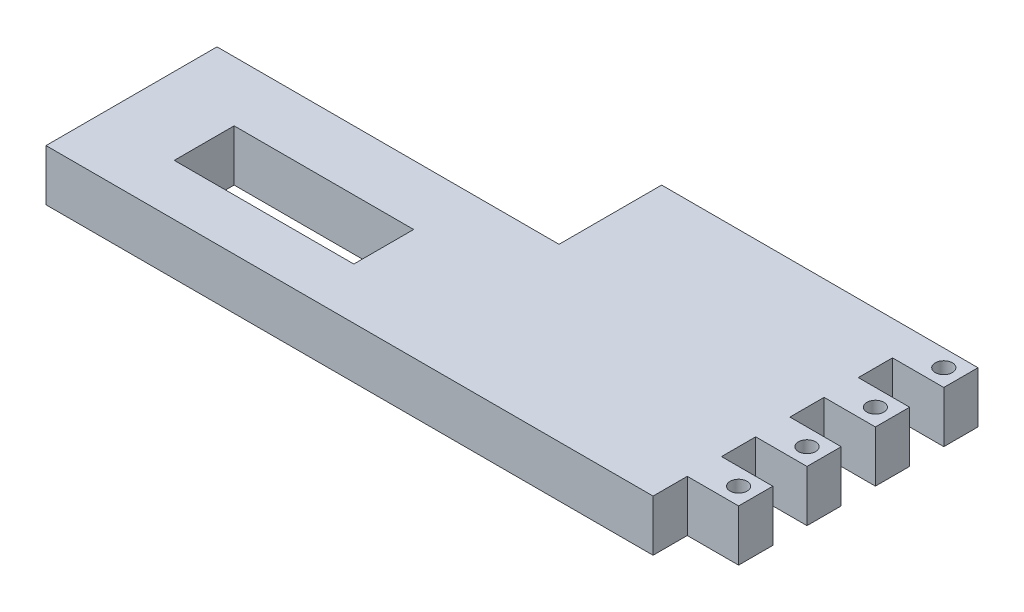
ISO-10303-21;
HEADER;
FILE_DESCRIPTION(('STEP AP214'),'2;1');
FILE_NAME('part.step','',(''),(''),'','','');
FILE_SCHEMA(('AUTOMOTIVE_DESIGN { 1 0 10303 214 1 1 1 1 }'));
ENDSEC;
DATA;
#1=APPLICATION_CONTEXT('core data for automotive mechanical design processes');
#2=APPLICATION_PROTOCOL_DEFINITION('international standard','automotive_design',2000,#1);
#3=PRODUCT_CONTEXT('',#1,'mechanical');
#4=PRODUCT('Part','Part','',(#3));
#5=PRODUCT_RELATED_PRODUCT_CATEGORY('part','',(#4));
#6=PRODUCT_DEFINITION_FORMATION('','',#4);
#7=PRODUCT_DEFINITION_CONTEXT('part definition',#1,'design');
#8=PRODUCT_DEFINITION('design','',#6,#7);
#9=PRODUCT_DEFINITION_SHAPE('','',#8);
#10=(LENGTH_UNIT() NAMED_UNIT(*) SI_UNIT(.MILLI.,.METRE.));
#11=(NAMED_UNIT(*) PLANE_ANGLE_UNIT() SI_UNIT($,.RADIAN.));
#12=(NAMED_UNIT(*) SI_UNIT($,.STERADIAN.) SOLID_ANGLE_UNIT());
#13=UNCERTAINTY_MEASURE_WITH_UNIT(LENGTH_MEASURE(1.E-05),#10,'distance_accuracy_value','');
#14=(GEOMETRIC_REPRESENTATION_CONTEXT(3) GLOBAL_UNCERTAINTY_ASSIGNED_CONTEXT((#13)) GLOBAL_UNIT_ASSIGNED_CONTEXT((#10,
#11,#12)) REPRESENTATION_CONTEXT('',''));
#15=CARTESIAN_POINT('',(0.,0.,0.));
#16=DIRECTION('',(0.,0.,1.));
#17=DIRECTION('',(1.,0.,0.));
#18=AXIS2_PLACEMENT_3D('',#15,#16,#17);
#19=CARTESIAN_POINT('',(-40.,6.,20.));
#20=DIRECTION('',(1.,0.,0.));
#21=DIRECTION('',(0.,0.,-1.));
#22=AXIS2_PLACEMENT_3D('',#19,#20,#21);
#23=PLANE('',#22);
#24=DIRECTION('',(0.,0.,1.));
#25=VECTOR('',#24,1.);
#26=CARTESIAN_POINT('',(-40.,0.,20.));
#27=LINE('',#26,#25);
#28=CARTESIAN_POINT('',(-40.,0.,0.));
#29=VERTEX_POINT('',#28);
#30=CARTESIAN_POINT('',(-40.,0.,20.));
#31=VERTEX_POINT('',#30);
#32=EDGE_CURVE('E232',#29,#31,#27,.T.);
#33=ORIENTED_EDGE('',*,*,#32,.T.);
#34=DIRECTION('',(0.,-1.,0.));
#35=VECTOR('',#34,1.);
#36=CARTESIAN_POINT('',(-40.,6.,20.));
#37=LINE('',#36,#35);
#38=CARTESIAN_POINT('',(-40.,6.,20.));
#39=VERTEX_POINT('',#38);
#40=EDGE_CURVE('E11',#39,#31,#37,.T.);
#41=ORIENTED_EDGE('',*,*,#40,.F.);
#42=DIRECTION('',(0.,0.,1.));
#43=VECTOR('',#42,1.);
#44=CARTESIAN_POINT('',(-40.,6.,20.));
#45=LINE('',#44,#43);
#46=CARTESIAN_POINT('',(-40.,6.,0.));
#47=VERTEX_POINT('',#46);
#48=EDGE_CURVE('E236',#47,#39,#45,.T.);
#49=ORIENTED_EDGE('',*,*,#48,.F.);
#50=DIRECTION('',(0.,-1.,0.));
#51=VECTOR('',#50,1.);
#52=CARTESIAN_POINT('',(-40.,6.,0.));
#53=LINE('',#52,#51);
#54=EDGE_CURVE('E278',#47,#29,#53,.T.);
#55=ORIENTED_EDGE('',*,*,#54,.T.);
#56=EDGE_LOOP('',(#33,#41,#49,#55));
#57=FACE_BOUND('',#56,.T.);
#58=ADVANCED_FACE('F35',(#57),#23,.F.);
#59=CARTESIAN_POINT('',(31.,6.,20.));
#60=DIRECTION('',(0.,0.,-1.));
#61=DIRECTION('',(-1.,0.,0.));
#62=AXIS2_PLACEMENT_3D('',#59,#60,#61);
#63=PLANE('',#62);
#64=DIRECTION('',(1.,0.,0.));
#65=VECTOR('',#64,1.);
#66=CARTESIAN_POINT('',(31.,0.,20.));
#67=LINE('',#66,#65);
#68=CARTESIAN_POINT('',(31.,0.,20.));
#69=VERTEX_POINT('',#68);
#70=EDGE_CURVE('E281',#31,#69,#67,.T.);
#71=ORIENTED_EDGE('',*,*,#70,.T.);
#72=DIRECTION('',(0.,-1.,0.));
#73=VECTOR('',#72,1.);
#74=CARTESIAN_POINT('',(31.,6.,20.));
#75=LINE('',#74,#73);
#76=CARTESIAN_POINT('',(31.,6.,20.));
#77=VERTEX_POINT('',#76);
#78=EDGE_CURVE('E42',#77,#69,#75,.T.);
#79=ORIENTED_EDGE('',*,*,#78,.F.);
#80=DIRECTION('',(1.,0.,0.));
#81=VECTOR('',#80,1.);
#82=CARTESIAN_POINT('',(31.,6.,20.));
#83=LINE('',#82,#81);
#84=EDGE_CURVE('E239',#39,#77,#83,.T.);
#85=ORIENTED_EDGE('',*,*,#84,.F.);
#86=ORIENTED_EDGE('',*,*,#40,.T.);
#87=EDGE_LOOP('',(#71,#79,#85,#86));
#88=FACE_BOUND('',#87,.T.);
#89=ADVANCED_FACE('F396',(#88),#63,.F.);
#90=CARTESIAN_POINT('',(31.,6.,16.));
#91=DIRECTION('',(-1.,0.,0.));
#92=DIRECTION('',(0.,0.,1.));
#93=AXIS2_PLACEMENT_3D('',#90,#91,#92);
#94=PLANE('',#93);
#95=DIRECTION('',(0.,0.,-1.));
#96=VECTOR('',#95,1.);
#97=CARTESIAN_POINT('',(31.,0.,16.));
#98=LINE('',#97,#96);
#99=CARTESIAN_POINT('',(31.,0.,16.));
#100=VERTEX_POINT('',#99);
#101=EDGE_CURVE('E283',#69,#100,#98,.T.);
#102=ORIENTED_EDGE('',*,*,#101,.T.);
#103=DIRECTION('',(0.,-1.,0.));
#104=VECTOR('',#103,1.);
#105=CARTESIAN_POINT('',(31.,6.,16.));
#106=LINE('',#105,#104);
#107=CARTESIAN_POINT('',(31.,6.,16.));
#108=VERTEX_POINT('',#107);
#109=EDGE_CURVE('E368',#108,#100,#106,.T.);
#110=ORIENTED_EDGE('',*,*,#109,.F.);
#111=DIRECTION('',(0.,0.,-1.));
#112=VECTOR('',#111,1.);
#113=CARTESIAN_POINT('',(31.,6.,16.));
#114=LINE('',#113,#112);
#115=EDGE_CURVE('E242',#77,#108,#114,.T.);
#116=ORIENTED_EDGE('',*,*,#115,.F.);
#117=ORIENTED_EDGE('',*,*,#78,.T.);
#118=EDGE_LOOP('',(#102,#110,#116,#117));
#119=FACE_BOUND('',#118,.T.);
#120=ADVANCED_FACE('F375',(#119),#94,.F.);
#121=CARTESIAN_POINT('',(37.,6.,16.));
#122=DIRECTION('',(0.,0.,-1.));
#123=DIRECTION('',(-1.,0.,0.));
#124=AXIS2_PLACEMENT_3D('',#121,#122,#123);
#125=PLANE('',#124);
#126=DIRECTION('',(1.,0.,0.));
#127=VECTOR('',#126,1.);
#128=CARTESIAN_POINT('',(37.,0.,16.));
#129=LINE('',#128,#127);
#130=CARTESIAN_POINT('',(37.,0.,16.));
#131=VERTEX_POINT('',#130);
#132=EDGE_CURVE('E285',#100,#131,#129,.T.);
#133=ORIENTED_EDGE('',*,*,#132,.T.);
#134=DIRECTION('',(0.,-1.,0.));
#135=VECTOR('',#134,1.);
#136=CARTESIAN_POINT('',(37.,6.,16.));
#137=LINE('',#136,#135);
#138=CARTESIAN_POINT('',(37.,6.,16.));
#139=VERTEX_POINT('',#138);
#140=EDGE_CURVE('E365',#139,#131,#137,.T.);
#141=ORIENTED_EDGE('',*,*,#140,.F.);
#142=DIRECTION('',(1.,0.,0.));
#143=VECTOR('',#142,1.);
#144=CARTESIAN_POINT('',(37.,6.,16.));
#145=LINE('',#144,#143);
#146=EDGE_CURVE('E244',#108,#139,#145,.T.);
#147=ORIENTED_EDGE('',*,*,#146,.F.);
#148=ORIENTED_EDGE('',*,*,#109,.T.);
#149=EDGE_LOOP('',(#133,#141,#147,#148));
#150=FACE_BOUND('',#149,.T.);
#151=ADVANCED_FACE('F384',(#150),#125,.F.);
#152=CARTESIAN_POINT('',(37.,6.,12.));
#153=DIRECTION('',(-1.,0.,0.));
#154=DIRECTION('',(0.,0.,1.));
#155=AXIS2_PLACEMENT_3D('',#152,#153,#154);
#156=PLANE('',#155);
#157=DIRECTION('',(0.,0.,-1.));
#158=VECTOR('',#157,1.);
#159=CARTESIAN_POINT('',(37.,0.,12.));
#160=LINE('',#159,#158);
#161=CARTESIAN_POINT('',(37.,0.,12.));
#162=VERTEX_POINT('',#161);
#163=EDGE_CURVE('E287',#131,#162,#160,.T.);
#164=ORIENTED_EDGE('',*,*,#163,.T.);
#165=DIRECTION('',(0.,-1.,0.));
#166=VECTOR('',#165,1.);
#167=CARTESIAN_POINT('',(37.,6.,12.));
#168=LINE('',#167,#166);
#169=CARTESIAN_POINT('',(37.,6.,12.));
#170=VERTEX_POINT('',#169);
#171=EDGE_CURVE('E362',#170,#162,#168,.T.);
#172=ORIENTED_EDGE('',*,*,#171,.F.);
#173=DIRECTION('',(0.,0.,-1.));
#174=VECTOR('',#173,1.);
#175=CARTESIAN_POINT('',(37.,6.,12.));
#176=LINE('',#175,#174);
#177=EDGE_CURVE('E246',#139,#170,#176,.T.);
#178=ORIENTED_EDGE('',*,*,#177,.F.);
#179=ORIENTED_EDGE('',*,*,#140,.T.);
#180=EDGE_LOOP('',(#164,#172,#178,#179));
#181=FACE_BOUND('',#180,.T.);
#182=ADVANCED_FACE('F388',(#181),#156,.F.);
#183=CARTESIAN_POINT('',(31.,6.,12.));
#184=DIRECTION('',(0.,0.,1.));
#185=DIRECTION('',(1.,0.,0.));
#186=AXIS2_PLACEMENT_3D('',#183,#184,#185);
#187=PLANE('',#186);
#188=DIRECTION('',(-1.,0.,0.));
#189=VECTOR('',#188,1.);
#190=CARTESIAN_POINT('',(31.,0.,12.));
#191=LINE('',#190,#189);
#192=CARTESIAN_POINT('',(31.,0.,12.));
#193=VERTEX_POINT('',#192);
#194=EDGE_CURVE('E289',#162,#193,#191,.T.);
#195=ORIENTED_EDGE('',*,*,#194,.T.);
#196=DIRECTION('',(0.,-1.,0.));
#197=VECTOR('',#196,1.);
#198=CARTESIAN_POINT('',(31.,6.,12.));
#199=LINE('',#198,#197);
#200=CARTESIAN_POINT('',(31.,6.,12.));
#201=VERTEX_POINT('',#200);
#202=EDGE_CURVE('E359',#201,#193,#199,.T.);
#203=ORIENTED_EDGE('',*,*,#202,.F.);
#204=DIRECTION('',(-1.,0.,0.));
#205=VECTOR('',#204,1.);
#206=CARTESIAN_POINT('',(31.,6.,12.));
#207=LINE('',#206,#205);
#208=EDGE_CURVE('E248',#170,#201,#207,.T.);
#209=ORIENTED_EDGE('',*,*,#208,.F.);
#210=ORIENTED_EDGE('',*,*,#171,.T.);
#211=EDGE_LOOP('',(#195,#203,#209,#210));
#212=FACE_BOUND('',#211,.T.);
#213=ADVANCED_FACE('F469',(#212),#187,.F.);
#214=CARTESIAN_POINT('',(31.,6.,12.));
#215=DIRECTION('',(-1.,0.,0.));
#216=DIRECTION('',(0.,0.,1.));
#217=AXIS2_PLACEMENT_3D('',#214,#215,#216);
#218=PLANE('',#217);
#219=DIRECTION('',(0.,0.,-1.));
#220=VECTOR('',#219,1.);
#221=CARTESIAN_POINT('',(31.,0.,12.));
#222=LINE('',#221,#220);
#223=CARTESIAN_POINT('',(31.,0.,8.));
#224=VERTEX_POINT('',#223);
#225=EDGE_CURVE('E291',#193,#224,#222,.T.);
#226=ORIENTED_EDGE('',*,*,#225,.T.);
#227=DIRECTION('',(0.,-1.,0.));
#228=VECTOR('',#227,1.);
#229=CARTESIAN_POINT('',(31.,6.,8.));
#230=LINE('',#229,#228);
#231=CARTESIAN_POINT('',(31.,6.,8.));
#232=VERTEX_POINT('',#231);
#233=EDGE_CURVE('E356',#232,#224,#230,.T.);
#234=ORIENTED_EDGE('',*,*,#233,.F.);
#235=DIRECTION('',(0.,0.,-1.));
#236=VECTOR('',#235,1.);
#237=CARTESIAN_POINT('',(31.,6.,12.));
#238=LINE('',#237,#236);
#239=EDGE_CURVE('E250',#201,#232,#238,.T.);
#240=ORIENTED_EDGE('',*,*,#239,.F.);
#241=ORIENTED_EDGE('',*,*,#202,.T.);
#242=EDGE_LOOP('',(#226,#234,#240,#241));
#243=FACE_BOUND('',#242,.T.);
#244=ADVANCED_FACE('F467',(#243),#218,.F.);
#245=CARTESIAN_POINT('',(37.,6.,8.));
#246=DIRECTION('',(0.,0.,-1.));
#247=DIRECTION('',(-1.,0.,0.));
#248=AXIS2_PLACEMENT_3D('',#245,#246,#247);
#249=PLANE('',#248);
#250=DIRECTION('',(1.,0.,0.));
#251=VECTOR('',#250,1.);
#252=CARTESIAN_POINT('',(37.,0.,8.));
#253=LINE('',#252,#251);
#254=CARTESIAN_POINT('',(37.,0.,8.));
#255=VERTEX_POINT('',#254);
#256=EDGE_CURVE('E293',#224,#255,#253,.T.);
#257=ORIENTED_EDGE('',*,*,#256,.T.);
#258=DIRECTION('',(0.,-1.,0.));
#259=VECTOR('',#258,1.);
#260=CARTESIAN_POINT('',(37.,6.,8.));
#261=LINE('',#260,#259);
#262=CARTESIAN_POINT('',(37.,6.,8.));
#263=VERTEX_POINT('',#262);
#264=EDGE_CURVE('E353',#263,#255,#261,.T.);
#265=ORIENTED_EDGE('',*,*,#264,.F.);
#266=DIRECTION('',(1.,0.,0.));
#267=VECTOR('',#266,1.);
#268=CARTESIAN_POINT('',(37.,6.,8.));
#269=LINE('',#268,#267);
#270=EDGE_CURVE('E252',#232,#263,#269,.T.);
#271=ORIENTED_EDGE('',*,*,#270,.F.);
#272=ORIENTED_EDGE('',*,*,#233,.T.);
#273=EDGE_LOOP('',(#257,#265,#271,#272));
#274=FACE_BOUND('',#273,.T.);
#275=ADVANCED_FACE('F462',(#274),#249,.F.);
#276=CARTESIAN_POINT('',(37.,6.,4.));
#277=DIRECTION('',(-1.,0.,0.));
#278=DIRECTION('',(0.,0.,1.));
#279=AXIS2_PLACEMENT_3D('',#276,#277,#278);
#280=PLANE('',#279);
#281=DIRECTION('',(0.,0.,-1.));
#282=VECTOR('',#281,1.);
#283=CARTESIAN_POINT('',(37.,0.,4.));
#284=LINE('',#283,#282);
#285=CARTESIAN_POINT('',(37.,0.,4.));
#286=VERTEX_POINT('',#285);
#287=EDGE_CURVE('E295',#255,#286,#284,.T.);
#288=ORIENTED_EDGE('',*,*,#287,.T.);
#289=DIRECTION('',(0.,-1.,0.));
#290=VECTOR('',#289,1.);
#291=CARTESIAN_POINT('',(37.,6.,4.));
#292=LINE('',#291,#290);
#293=CARTESIAN_POINT('',(37.,6.,4.));
#294=VERTEX_POINT('',#293);
#295=EDGE_CURVE('E350',#294,#286,#292,.T.);
#296=ORIENTED_EDGE('',*,*,#295,.F.);
#297=DIRECTION('',(0.,0.,-1.));
#298=VECTOR('',#297,1.);
#299=CARTESIAN_POINT('',(37.,6.,4.));
#300=LINE('',#299,#298);
#301=EDGE_CURVE('E254',#263,#294,#300,.T.);
#302=ORIENTED_EDGE('',*,*,#301,.F.);
#303=ORIENTED_EDGE('',*,*,#264,.T.);
#304=EDGE_LOOP('',(#288,#296,#302,#303));
#305=FACE_BOUND('',#304,.T.);
#306=ADVANCED_FACE('F457',(#305),#280,.F.);
#307=CARTESIAN_POINT('',(31.,6.,4.));
#308=DIRECTION('',(0.,0.,1.));
#309=DIRECTION('',(1.,0.,0.));
#310=AXIS2_PLACEMENT_3D('',#307,#308,#309);
#311=PLANE('',#310);
#312=DIRECTION('',(-1.,0.,0.));
#313=VECTOR('',#312,1.);
#314=CARTESIAN_POINT('',(31.,0.,4.));
#315=LINE('',#314,#313);
#316=CARTESIAN_POINT('',(31.,0.,4.));
#317=VERTEX_POINT('',#316);
#318=EDGE_CURVE('E297',#286,#317,#315,.T.);
#319=ORIENTED_EDGE('',*,*,#318,.T.);
#320=DIRECTION('',(0.,-1.,0.));
#321=VECTOR('',#320,1.);
#322=CARTESIAN_POINT('',(31.,6.,4.));
#323=LINE('',#322,#321);
#324=CARTESIAN_POINT('',(31.,6.,4.));
#325=VERTEX_POINT('',#324);
#326=EDGE_CURVE('E347',#325,#317,#323,.T.);
#327=ORIENTED_EDGE('',*,*,#326,.F.);
#328=DIRECTION('',(-1.,0.,0.));
#329=VECTOR('',#328,1.);
#330=CARTESIAN_POINT('',(31.,6.,4.));
#331=LINE('',#330,#329);
#332=EDGE_CURVE('E256',#294,#325,#331,.T.);
#333=ORIENTED_EDGE('',*,*,#332,.F.);
#334=ORIENTED_EDGE('',*,*,#295,.T.);
#335=EDGE_LOOP('',(#319,#327,#333,#334));
#336=FACE_BOUND('',#335,.T.);
#337=ADVANCED_FACE('F453',(#336),#311,.F.);
#338=CARTESIAN_POINT('',(31.,6.,0.));
#339=DIRECTION('',(-1.,0.,0.));
#340=DIRECTION('',(0.,0.,1.));
#341=AXIS2_PLACEMENT_3D('',#338,#339,#340);
#342=PLANE('',#341);
#343=DIRECTION('',(0.,0.,-1.));
#344=VECTOR('',#343,1.);
#345=CARTESIAN_POINT('',(31.,0.,0.));
#346=LINE('',#345,#344);
#347=CARTESIAN_POINT('',(31.,0.,0.));
#348=VERTEX_POINT('',#347);
#349=EDGE_CURVE('E299',#317,#348,#346,.T.);
#350=ORIENTED_EDGE('',*,*,#349,.T.);
#351=DIRECTION('',(0.,-1.,0.));
#352=VECTOR('',#351,1.);
#353=CARTESIAN_POINT('',(31.,6.,0.));
#354=LINE('',#353,#352);
#355=CARTESIAN_POINT('',(31.,6.,0.));
#356=VERTEX_POINT('',#355);
#357=EDGE_CURVE('E344',#356,#348,#354,.T.);
#358=ORIENTED_EDGE('',*,*,#357,.F.);
#359=DIRECTION('',(0.,0.,-1.));
#360=VECTOR('',#359,1.);
#361=CARTESIAN_POINT('',(31.,6.,0.));
#362=LINE('',#361,#360);
#363=EDGE_CURVE('E258',#325,#356,#362,.T.);
#364=ORIENTED_EDGE('',*,*,#363,.F.);
#365=ORIENTED_EDGE('',*,*,#326,.T.);
#366=EDGE_LOOP('',(#350,#358,#364,#365));
#367=FACE_BOUND('',#366,.T.);
#368=ADVANCED_FACE('F448',(#367),#342,.F.);
#369=CARTESIAN_POINT('',(37.,6.,0.));
#370=DIRECTION('',(0.,0.,-1.));
#371=DIRECTION('',(-1.,0.,0.));
#372=AXIS2_PLACEMENT_3D('',#369,#370,#371);
#373=PLANE('',#372);
#374=DIRECTION('',(1.,0.,0.));
#375=VECTOR('',#374,1.);
#376=CARTESIAN_POINT('',(37.,0.,0.));
#377=LINE('',#376,#375);
#378=CARTESIAN_POINT('',(37.,0.,0.));
#379=VERTEX_POINT('',#378);
#380=EDGE_CURVE('E301',#348,#379,#377,.T.);
#381=ORIENTED_EDGE('',*,*,#380,.T.);
#382=DIRECTION('',(0.,-1.,0.));
#383=VECTOR('',#382,1.);
#384=CARTESIAN_POINT('',(37.,6.,0.));
#385=LINE('',#384,#383);
#386=CARTESIAN_POINT('',(37.,6.,0.));
#387=VERTEX_POINT('',#386);
#388=EDGE_CURVE('E341',#387,#379,#385,.T.);
#389=ORIENTED_EDGE('',*,*,#388,.F.);
#390=DIRECTION('',(1.,0.,0.));
#391=VECTOR('',#390,1.);
#392=CARTESIAN_POINT('',(37.,6.,0.));
#393=LINE('',#392,#391);
#394=EDGE_CURVE('E260',#356,#387,#393,.T.);
#395=ORIENTED_EDGE('',*,*,#394,.F.);
#396=ORIENTED_EDGE('',*,*,#357,.T.);
#397=EDGE_LOOP('',(#381,#389,#395,#396));
#398=FACE_BOUND('',#397,.T.);
#399=ADVANCED_FACE('F442',(#398),#373,.F.);
#400=CARTESIAN_POINT('',(37.,6.,0.));
#401=DIRECTION('',(-1.,0.,0.));
#402=DIRECTION('',(0.,0.,1.));
#403=AXIS2_PLACEMENT_3D('',#400,#401,#402);
#404=PLANE('',#403);
#405=DIRECTION('',(0.,0.,-1.));
#406=VECTOR('',#405,1.);
#407=CARTESIAN_POINT('',(37.,0.,0.));
#408=LINE('',#407,#406);
#409=CARTESIAN_POINT('',(37.,0.,-4.));
#410=VERTEX_POINT('',#409);
#411=EDGE_CURVE('E303',#379,#410,#408,.T.);
#412=ORIENTED_EDGE('',*,*,#411,.T.);
#413=DIRECTION('',(0.,-1.,0.));
#414=VECTOR('',#413,1.);
#415=CARTESIAN_POINT('',(37.,6.,-4.));
#416=LINE('',#415,#414);
#417=CARTESIAN_POINT('',(37.,6.,-4.));
#418=VERTEX_POINT('',#417);
#419=EDGE_CURVE('E338',#418,#410,#416,.T.);
#420=ORIENTED_EDGE('',*,*,#419,.F.);
#421=DIRECTION('',(0.,0.,-1.));
#422=VECTOR('',#421,1.);
#423=CARTESIAN_POINT('',(37.,6.,0.));
#424=LINE('',#423,#422);
#425=EDGE_CURVE('E262',#387,#418,#424,.T.);
#426=ORIENTED_EDGE('',*,*,#425,.F.);
#427=ORIENTED_EDGE('',*,*,#388,.T.);
#428=EDGE_LOOP('',(#412,#420,#426,#427));
#429=FACE_BOUND('',#428,.T.);
#430=ADVANCED_FACE('F438',(#429),#404,.F.);
#431=CARTESIAN_POINT('',(37.,6.,-4.));
#432=DIRECTION('',(0.,0.,1.));
#433=DIRECTION('',(1.,0.,0.));
#434=AXIS2_PLACEMENT_3D('',#431,#432,#433);
#435=PLANE('',#434);
#436=DIRECTION('',(-1.,0.,0.));
#437=VECTOR('',#436,1.);
#438=CARTESIAN_POINT('',(37.,0.,-4.));
#439=LINE('',#438,#437);
#440=CARTESIAN_POINT('',(31.,0.,-4.));
#441=VERTEX_POINT('',#440);
#442=EDGE_CURVE('E305',#410,#441,#439,.T.);
#443=ORIENTED_EDGE('',*,*,#442,.T.);
#444=DIRECTION('',(0.,-1.,0.));
#445=VECTOR('',#444,1.);
#446=CARTESIAN_POINT('',(31.,6.,-4.));
#447=LINE('',#446,#445);
#448=CARTESIAN_POINT('',(31.,6.,-4.));
#449=VERTEX_POINT('',#448);
#450=EDGE_CURVE('E335',#449,#441,#447,.T.);
#451=ORIENTED_EDGE('',*,*,#450,.F.);
#452=DIRECTION('',(-1.,0.,0.));
#453=VECTOR('',#452,1.);
#454=CARTESIAN_POINT('',(37.,6.,-4.));
#455=LINE('',#454,#453);
#456=EDGE_CURVE('E264',#418,#449,#455,.T.);
#457=ORIENTED_EDGE('',*,*,#456,.F.);
#458=ORIENTED_EDGE('',*,*,#419,.T.);
#459=EDGE_LOOP('',(#443,#451,#457,#458));
#460=FACE_BOUND('',#459,.T.);
#461=ADVANCED_FACE('F433',(#460),#435,.F.);
#462=CARTESIAN_POINT('',(31.,6.,-4.));
#463=DIRECTION('',(-1.,0.,0.));
#464=DIRECTION('',(0.,0.,1.));
#465=AXIS2_PLACEMENT_3D('',#462,#463,#464);
#466=PLANE('',#465);
#467=DIRECTION('',(0.,0.,-1.));
#468=VECTOR('',#467,1.);
#469=CARTESIAN_POINT('',(31.,0.,-4.));
#470=LINE('',#469,#468);
#471=CARTESIAN_POINT('',(31.,0.,-8.));
#472=VERTEX_POINT('',#471);
#473=EDGE_CURVE('E307',#441,#472,#470,.T.);
#474=ORIENTED_EDGE('',*,*,#473,.T.);
#475=DIRECTION('',(0.,-1.,0.));
#476=VECTOR('',#475,1.);
#477=CARTESIAN_POINT('',(31.,6.,-8.));
#478=LINE('',#477,#476);
#479=CARTESIAN_POINT('',(31.,6.,-8.));
#480=VERTEX_POINT('',#479);
#481=EDGE_CURVE('E332',#480,#472,#478,.T.);
#482=ORIENTED_EDGE('',*,*,#481,.F.);
#483=DIRECTION('',(0.,0.,-1.));
#484=VECTOR('',#483,1.);
#485=CARTESIAN_POINT('',(31.,6.,-4.));
#486=LINE('',#485,#484);
#487=EDGE_CURVE('E266',#449,#480,#486,.T.);
#488=ORIENTED_EDGE('',*,*,#487,.F.);
#489=ORIENTED_EDGE('',*,*,#450,.T.);
#490=EDGE_LOOP('',(#474,#482,#488,#489));
#491=FACE_BOUND('',#490,.T.);
#492=ADVANCED_FACE('F427',(#491),#466,.F.);
#493=CARTESIAN_POINT('',(31.,6.,-8.));
#494=DIRECTION('',(0.,0.,-1.));
#495=DIRECTION('',(-1.,0.,0.));
#496=AXIS2_PLACEMENT_3D('',#493,#494,#495);
#497=PLANE('',#496);
#498=DIRECTION('',(1.,0.,0.));
#499=VECTOR('',#498,1.);
#500=CARTESIAN_POINT('',(31.,0.,-8.));
#501=LINE('',#500,#499);
#502=CARTESIAN_POINT('',(37.,0.,-8.));
#503=VERTEX_POINT('',#502);
#504=EDGE_CURVE('E309',#472,#503,#501,.T.);
#505=ORIENTED_EDGE('',*,*,#504,.T.);
#506=DIRECTION('',(0.,-1.,0.));
#507=VECTOR('',#506,1.);
#508=CARTESIAN_POINT('',(37.,6.,-8.));
#509=LINE('',#508,#507);
#510=CARTESIAN_POINT('',(37.,6.,-8.));
#511=VERTEX_POINT('',#510);
#512=EDGE_CURVE('E329',#511,#503,#509,.T.);
#513=ORIENTED_EDGE('',*,*,#512,.F.);
#514=DIRECTION('',(1.,0.,0.));
#515=VECTOR('',#514,1.);
#516=CARTESIAN_POINT('',(31.,6.,-8.));
#517=LINE('',#516,#515);
#518=EDGE_CURVE('E268',#480,#511,#517,.T.);
#519=ORIENTED_EDGE('',*,*,#518,.F.);
#520=ORIENTED_EDGE('',*,*,#481,.T.);
#521=EDGE_LOOP('',(#505,#513,#519,#520));
#522=FACE_BOUND('',#521,.T.);
#523=ADVANCED_FACE('F423',(#522),#497,.F.);
#524=CARTESIAN_POINT('',(37.,6.,-8.));
#525=DIRECTION('',(-1.,0.,0.));
#526=DIRECTION('',(0.,0.,1.));
#527=AXIS2_PLACEMENT_3D('',#524,#525,#526);
#528=PLANE('',#527);
#529=DIRECTION('',(0.,0.,-1.));
#530=VECTOR('',#529,1.);
#531=CARTESIAN_POINT('',(37.,0.,-8.));
#532=LINE('',#531,#530);
#533=CARTESIAN_POINT('',(37.,0.,-12.));
#534=VERTEX_POINT('',#533);
#535=EDGE_CURVE('E311',#503,#534,#532,.T.);
#536=ORIENTED_EDGE('',*,*,#535,.T.);
#537=DIRECTION('',(0.,-1.,0.));
#538=VECTOR('',#537,1.);
#539=CARTESIAN_POINT('',(37.,6.,-12.));
#540=LINE('',#539,#538);
#541=CARTESIAN_POINT('',(37.,6.,-12.));
#542=VERTEX_POINT('',#541);
#543=EDGE_CURVE('E326',#542,#534,#540,.T.);
#544=ORIENTED_EDGE('',*,*,#543,.F.);
#545=DIRECTION('',(0.,0.,-1.));
#546=VECTOR('',#545,1.);
#547=CARTESIAN_POINT('',(37.,6.,-8.));
#548=LINE('',#547,#546);
#549=EDGE_CURVE('E270',#511,#542,#548,.T.);
#550=ORIENTED_EDGE('',*,*,#549,.F.);
#551=ORIENTED_EDGE('',*,*,#512,.T.);
#552=EDGE_LOOP('',(#536,#544,#550,#551));
#553=FACE_BOUND('',#552,.T.);
#554=ADVANCED_FACE('F418',(#553),#528,.F.);
#555=CARTESIAN_POINT('',(0.,6.,-12.));
#556=DIRECTION('',(0.,0.,1.));
#557=DIRECTION('',(1.,0.,0.));
#558=AXIS2_PLACEMENT_3D('',#555,#556,#557);
#559=PLANE('',#558);
#560=DIRECTION('',(-1.,0.,0.));
#561=VECTOR('',#560,1.);
#562=CARTESIAN_POINT('',(0.,0.,-12.));
#563=LINE('',#562,#561);
#564=CARTESIAN_POINT('',(0.,0.,-12.));
#565=VERTEX_POINT('',#564);
#566=EDGE_CURVE('E313',#534,#565,#563,.T.);
#567=ORIENTED_EDGE('',*,*,#566,.T.);
#568=DIRECTION('',(0.,-1.,0.));
#569=VECTOR('',#568,1.);
#570=CARTESIAN_POINT('',(0.,6.,-12.));
#571=LINE('',#570,#569);
#572=CARTESIAN_POINT('',(0.,6.,-12.));
#573=VERTEX_POINT('',#572);
#574=EDGE_CURVE('E323',#573,#565,#571,.T.);
#575=ORIENTED_EDGE('',*,*,#574,.F.);
#576=DIRECTION('',(-1.,0.,0.));
#577=VECTOR('',#576,1.);
#578=CARTESIAN_POINT('',(0.,6.,-12.));
#579=LINE('',#578,#577);
#580=EDGE_CURVE('E272',#542,#573,#579,.T.);
#581=ORIENTED_EDGE('',*,*,#580,.F.);
#582=ORIENTED_EDGE('',*,*,#543,.T.);
#583=EDGE_LOOP('',(#567,#575,#581,#582));
#584=FACE_BOUND('',#583,.T.);
#585=ADVANCED_FACE('F412',(#584),#559,.F.);
#586=CARTESIAN_POINT('',(0.,6.,0.));
#587=DIRECTION('',(1.,0.,0.));
#588=DIRECTION('',(0.,0.,-1.));
#589=AXIS2_PLACEMENT_3D('',#586,#587,#588);
#590=PLANE('',#589);
#591=DIRECTION('',(0.,0.,1.));
#592=VECTOR('',#591,1.);
#593=CARTESIAN_POINT('',(0.,0.,0.));
#594=LINE('',#593,#592);
#595=CARTESIAN_POINT('',(0.,0.,0.));
#596=VERTEX_POINT('',#595);
#597=EDGE_CURVE('E315',#565,#596,#594,.T.);
#598=ORIENTED_EDGE('',*,*,#597,.T.);
#599=DIRECTION('',(0.,-1.,0.));
#600=VECTOR('',#599,1.);
#601=CARTESIAN_POINT('',(0.,6.,0.));
#602=LINE('',#601,#600);
#603=CARTESIAN_POINT('',(0.,6.,0.));
#604=VERTEX_POINT('',#603);
#605=EDGE_CURVE('E320',#604,#596,#602,.T.);
#606=ORIENTED_EDGE('',*,*,#605,.F.);
#607=DIRECTION('',(0.,0.,1.));
#608=VECTOR('',#607,1.);
#609=CARTESIAN_POINT('',(0.,6.,0.));
#610=LINE('',#609,#608);
#611=EDGE_CURVE('E274',#573,#604,#610,.T.);
#612=ORIENTED_EDGE('',*,*,#611,.F.);
#613=ORIENTED_EDGE('',*,*,#574,.T.);
#614=EDGE_LOOP('',(#598,#606,#612,#613));
#615=FACE_BOUND('',#614,.T.);
#616=ADVANCED_FACE('F408',(#615),#590,.F.);
#617=CARTESIAN_POINT('',(-40.,6.,0.));
#618=DIRECTION('',(0.,0.,1.));
#619=DIRECTION('',(1.,0.,0.));
#620=AXIS2_PLACEMENT_3D('',#617,#618,#619);
#621=PLANE('',#620);
#622=DIRECTION('',(-1.,0.,0.));
#623=VECTOR('',#622,1.);
#624=CARTESIAN_POINT('',(-40.,0.,0.));
#625=LINE('',#624,#623);
#626=EDGE_CURVE('E240',#596,#29,#625,.T.);
#627=ORIENTED_EDGE('',*,*,#626,.T.);
#628=ORIENTED_EDGE('',*,*,#54,.F.);
#629=DIRECTION('',(-1.,0.,0.));
#630=VECTOR('',#629,1.);
#631=CARTESIAN_POINT('',(-40.,6.,0.));
#632=LINE('',#631,#630);
#633=EDGE_CURVE('E276',#604,#47,#632,.T.);
#634=ORIENTED_EDGE('',*,*,#633,.F.);
#635=ORIENTED_EDGE('',*,*,#605,.T.);
#636=EDGE_LOOP('',(#627,#628,#634,#635));
#637=FACE_BOUND('',#636,.T.);
#638=ADVANCED_FACE('F403',(#637),#621,.F.);
#639=CARTESIAN_POINT('',(0.,6.,0.));
#640=DIRECTION('',(0.,-1.,0.));
#641=DIRECTION('',(0.,0.,-1.));
#642=AXIS2_PLACEMENT_3D('',#639,#640,#641);
#643=PLANE('',#642);
#644=CARTESIAN_POINT('',(35.,6.,14.));
#645=DIRECTION('',(0.,1.,0.));
#646=DIRECTION('',(0.,0.,1.));
#647=AXIS2_PLACEMENT_3D('',#644,#645,#646);
#648=CIRCLE('',#647,0.999999999999998);
#649=CARTESIAN_POINT('',(35.,6.,15.));
#650=VERTEX_POINT('',#649);
#651=EDGE_CURVE('E713',#650,#650,#648,.T.);
#652=ORIENTED_EDGE('',*,*,#651,.F.);
#653=EDGE_LOOP('',(#652));
#654=FACE_BOUND('',#653,.T.);
#655=CARTESIAN_POINT('',(35.,6.,6.));
#656=DIRECTION('',(0.,1.,0.));
#657=DIRECTION('',(0.,0.,1.));
#658=AXIS2_PLACEMENT_3D('',#655,#656,#657);
#659=CIRCLE('',#658,0.999999999999998);
#660=CARTESIAN_POINT('',(35.,6.,7.));
#661=VERTEX_POINT('',#660);
#662=EDGE_CURVE('E715',#661,#661,#659,.T.);
#663=ORIENTED_EDGE('',*,*,#662,.F.);
#664=EDGE_LOOP('',(#663));
#665=FACE_BOUND('',#664,.T.);
#666=CARTESIAN_POINT('',(35.,6.,-2.));
#667=DIRECTION('',(0.,1.,0.));
#668=DIRECTION('',(0.,0.,1.));
#669=AXIS2_PLACEMENT_3D('',#666,#667,#668);
#670=CIRCLE('',#669,0.999999999999998);
#671=CARTESIAN_POINT('',(35.,6.,-1.));
#672=VERTEX_POINT('',#671);
#673=EDGE_CURVE('E721',#672,#672,#670,.T.);
#674=ORIENTED_EDGE('',*,*,#673,.F.);
#675=EDGE_LOOP('',(#674));
#676=FACE_BOUND('',#675,.T.);
#677=CARTESIAN_POINT('',(35.,6.,-10.));
#678=DIRECTION('',(0.,1.,0.));
#679=DIRECTION('',(0.,0.,1.));
#680=AXIS2_PLACEMENT_3D('',#677,#678,#679);
#681=CIRCLE('',#680,0.999999999999998);
#682=CARTESIAN_POINT('',(35.,6.,-9.));
#683=VERTEX_POINT('',#682);
#684=EDGE_CURVE('E219',#683,#683,#681,.T.);
#685=ORIENTED_EDGE('',*,*,#684,.F.);
#686=EDGE_LOOP('',(#685));
#687=FACE_BOUND('',#686,.T.);
#688=DIRECTION('',(1.,0.,0.));
#689=VECTOR('',#688,1.);
#690=CARTESIAN_POINT('',(-31.,6.,14.));
#691=LINE('',#690,#689);
#692=CARTESIAN_POINT('',(-31.,6.,14.));
#693=VERTEX_POINT('',#692);
#694=CARTESIAN_POINT('',(-10.,6.,14.));
#695=VERTEX_POINT('',#694);
#696=EDGE_CURVE('E225',#693,#695,#691,.T.);
#697=ORIENTED_EDGE('',*,*,#696,.F.);
#698=DIRECTION('',(0.,0.,1.));
#699=VECTOR('',#698,1.);
#700=CARTESIAN_POINT('',(-31.,6.,7.));
#701=LINE('',#700,#699);
#702=CARTESIAN_POINT('',(-31.,6.,7.));
#703=VERTEX_POINT('',#702);
#704=EDGE_CURVE('E49',#703,#693,#701,.T.);
#705=ORIENTED_EDGE('',*,*,#704,.F.);
#706=DIRECTION('',(-1.,0.,0.));
#707=VECTOR('',#706,1.);
#708=CARTESIAN_POINT('',(-31.,6.,7.));
#709=LINE('',#708,#707);
#710=CARTESIAN_POINT('',(-10.,6.,7.));
#711=VERTEX_POINT('',#710);
#712=EDGE_CURVE('E213',#711,#703,#709,.T.);
#713=ORIENTED_EDGE('',*,*,#712,.F.);
#714=DIRECTION('',(0.,0.,-1.));
#715=VECTOR('',#714,1.);
#716=CARTESIAN_POINT('',(-10.,6.,7.));
#717=LINE('',#716,#715);
#718=EDGE_CURVE('E216',#695,#711,#717,.T.);
#719=ORIENTED_EDGE('',*,*,#718,.F.);
#720=EDGE_LOOP('',(#697,#705,#713,#719));
#721=FACE_BOUND('',#720,.T.);
#722=ORIENTED_EDGE('',*,*,#48,.T.);
#723=ORIENTED_EDGE('',*,*,#84,.T.);
#724=ORIENTED_EDGE('',*,*,#115,.T.);
#725=ORIENTED_EDGE('',*,*,#146,.T.);
#726=ORIENTED_EDGE('',*,*,#177,.T.);
#727=ORIENTED_EDGE('',*,*,#208,.T.);
#728=ORIENTED_EDGE('',*,*,#239,.T.);
#729=ORIENTED_EDGE('',*,*,#270,.T.);
#730=ORIENTED_EDGE('',*,*,#301,.T.);
#731=ORIENTED_EDGE('',*,*,#332,.T.);
#732=ORIENTED_EDGE('',*,*,#363,.T.);
#733=ORIENTED_EDGE('',*,*,#394,.T.);
#734=ORIENTED_EDGE('',*,*,#425,.T.);
#735=ORIENTED_EDGE('',*,*,#456,.T.);
#736=ORIENTED_EDGE('',*,*,#487,.T.);
#737=ORIENTED_EDGE('',*,*,#518,.T.);
#738=ORIENTED_EDGE('',*,*,#549,.T.);
#739=ORIENTED_EDGE('',*,*,#580,.T.);
#740=ORIENTED_EDGE('',*,*,#611,.T.);
#741=ORIENTED_EDGE('',*,*,#633,.T.);
#742=EDGE_LOOP('',(#722,#723,#724,#725,#726,#727,#728,#729,#730,#731,#732,#733,#734,#735,#736,
#737,#738,#739,#740,#741));
#743=FACE_BOUND('',#742,.T.);
#744=ADVANCED_FACE('F392',(#654,#665,#676,#687,#721,#743),#643,.F.);
#745=CARTESIAN_POINT('',(0.,0.,0.));
#746=DIRECTION('',(0.,-1.,0.));
#747=DIRECTION('',(0.,0.,-1.));
#748=AXIS2_PLACEMENT_3D('',#745,#746,#747);
#749=PLANE('',#748);
#750=CARTESIAN_POINT('',(35.,0.,14.));
#751=DIRECTION('',(0.,1.,0.));
#752=DIRECTION('',(0.,0.,1.));
#753=AXIS2_PLACEMENT_3D('',#750,#751,#752);
#754=CIRCLE('',#753,0.999999999999998);
#755=CARTESIAN_POINT('',(35.,0.,15.));
#756=VERTEX_POINT('',#755);
#757=EDGE_CURVE('E710',#756,#756,#754,.T.);
#758=ORIENTED_EDGE('',*,*,#757,.T.);
#759=EDGE_LOOP('',(#758));
#760=FACE_BOUND('',#759,.T.);
#761=CARTESIAN_POINT('',(35.,0.,6.));
#762=DIRECTION('',(0.,1.,0.));
#763=DIRECTION('',(0.,0.,1.));
#764=AXIS2_PLACEMENT_3D('',#761,#762,#763);
#765=CIRCLE('',#764,0.999999999999998);
#766=CARTESIAN_POINT('',(35.,0.,7.));
#767=VERTEX_POINT('',#766);
#768=EDGE_CURVE('E718',#767,#767,#765,.T.);
#769=ORIENTED_EDGE('',*,*,#768,.T.);
#770=EDGE_LOOP('',(#769));
#771=FACE_BOUND('',#770,.T.);
#772=CARTESIAN_POINT('',(35.,0.,-2.));
#773=DIRECTION('',(0.,1.,0.));
#774=DIRECTION('',(0.,0.,1.));
#775=AXIS2_PLACEMENT_3D('',#772,#773,#774);
#776=CIRCLE('',#775,0.999999999999998);
#777=CARTESIAN_POINT('',(35.,0.,-1.));
#778=VERTEX_POINT('',#777);
#779=EDGE_CURVE('E724',#778,#778,#776,.T.);
#780=ORIENTED_EDGE('',*,*,#779,.T.);
#781=EDGE_LOOP('',(#780));
#782=FACE_BOUND('',#781,.T.);
#783=CARTESIAN_POINT('',(35.,0.,-10.));
#784=DIRECTION('',(0.,1.,0.));
#785=DIRECTION('',(0.,0.,1.));
#786=AXIS2_PLACEMENT_3D('',#783,#784,#785);
#787=CIRCLE('',#786,0.999999999999998);
#788=CARTESIAN_POINT('',(35.,0.,-9.));
#789=VERTEX_POINT('',#788);
#790=EDGE_CURVE('E226',#789,#789,#787,.T.);
#791=ORIENTED_EDGE('',*,*,#790,.T.);
#792=EDGE_LOOP('',(#791));
#793=FACE_BOUND('',#792,.T.);
#794=DIRECTION('',(0.,0.,1.));
#795=VECTOR('',#794,1.);
#796=CARTESIAN_POINT('',(-31.,0.,7.));
#797=LINE('',#796,#795);
#798=CARTESIAN_POINT('',(-31.,0.,7.));
#799=VERTEX_POINT('',#798);
#800=CARTESIAN_POINT('',(-31.,0.,14.));
#801=VERTEX_POINT('',#800);
#802=EDGE_CURVE('E197',#799,#801,#797,.T.);
#803=ORIENTED_EDGE('',*,*,#802,.T.);
#804=DIRECTION('',(1.,0.,0.));
#805=VECTOR('',#804,1.);
#806=CARTESIAN_POINT('',(-31.,0.,14.));
#807=LINE('',#806,#805);
#808=CARTESIAN_POINT('',(-10.,0.,14.));
#809=VERTEX_POINT('',#808);
#810=EDGE_CURVE('E206',#801,#809,#807,.T.);
#811=ORIENTED_EDGE('',*,*,#810,.T.);
#812=DIRECTION('',(0.,0.,-1.));
#813=VECTOR('',#812,1.);
#814=CARTESIAN_POINT('',(-10.,0.,7.));
#815=LINE('',#814,#813);
#816=CARTESIAN_POINT('',(-10.,0.,7.));
#817=VERTEX_POINT('',#816);
#818=EDGE_CURVE('E57',#809,#817,#815,.T.);
#819=ORIENTED_EDGE('',*,*,#818,.T.);
#820=DIRECTION('',(-1.,0.,0.));
#821=VECTOR('',#820,1.);
#822=CARTESIAN_POINT('',(-31.,0.,7.));
#823=LINE('',#822,#821);
#824=EDGE_CURVE('E203',#817,#799,#823,.T.);
#825=ORIENTED_EDGE('',*,*,#824,.T.);
#826=EDGE_LOOP('',(#803,#811,#819,#825));
#827=FACE_BOUND('',#826,.T.);
#828=ORIENTED_EDGE('',*,*,#32,.F.);
#829=ORIENTED_EDGE('',*,*,#626,.F.);
#830=ORIENTED_EDGE('',*,*,#597,.F.);
#831=ORIENTED_EDGE('',*,*,#566,.F.);
#832=ORIENTED_EDGE('',*,*,#535,.F.);
#833=ORIENTED_EDGE('',*,*,#504,.F.);
#834=ORIENTED_EDGE('',*,*,#473,.F.);
#835=ORIENTED_EDGE('',*,*,#442,.F.);
#836=ORIENTED_EDGE('',*,*,#411,.F.);
#837=ORIENTED_EDGE('',*,*,#380,.F.);
#838=ORIENTED_EDGE('',*,*,#349,.F.);
#839=ORIENTED_EDGE('',*,*,#318,.F.);
#840=ORIENTED_EDGE('',*,*,#287,.F.);
#841=ORIENTED_EDGE('',*,*,#256,.F.);
#842=ORIENTED_EDGE('',*,*,#225,.F.);
#843=ORIENTED_EDGE('',*,*,#194,.F.);
#844=ORIENTED_EDGE('',*,*,#163,.F.);
#845=ORIENTED_EDGE('',*,*,#132,.F.);
#846=ORIENTED_EDGE('',*,*,#101,.F.);
#847=ORIENTED_EDGE('',*,*,#70,.F.);
#848=EDGE_LOOP('',(#828,#829,#830,#831,#832,#833,#834,#835,#836,#837,#838,#839,#840,#841,#842,
#843,#844,#845,#846,#847));
#849=FACE_BOUND('',#848,.T.);
#850=ADVANCED_FACE('F210',(#760,#771,#782,#793,#827,#849),#749,.T.);
#851=CARTESIAN_POINT('',(-31.,0.,7.));
#852=DIRECTION('',(-1.,0.,0.));
#853=DIRECTION('',(0.,0.,1.));
#854=AXIS2_PLACEMENT_3D('',#851,#852,#853);
#855=PLANE('',#854);
#856=ORIENTED_EDGE('',*,*,#704,.T.);
#857=DIRECTION('',(0.,1.,0.));
#858=VECTOR('',#857,1.);
#859=CARTESIAN_POINT('',(-31.,0.,14.));
#860=LINE('',#859,#858);
#861=EDGE_CURVE('E193',#801,#693,#860,.T.);
#862=ORIENTED_EDGE('',*,*,#861,.F.);
#863=ORIENTED_EDGE('',*,*,#802,.F.);
#864=DIRECTION('',(0.,1.,0.));
#865=VECTOR('',#864,1.);
#866=CARTESIAN_POINT('',(-31.,0.,7.));
#867=LINE('',#866,#865);
#868=EDGE_CURVE('E230',#799,#703,#867,.T.);
#869=ORIENTED_EDGE('',*,*,#868,.T.);
#870=EDGE_LOOP('',(#856,#862,#863,#869));
#871=FACE_BOUND('',#870,.T.);
#872=ADVANCED_FACE('F195',(#871),#855,.F.);
#873=CARTESIAN_POINT('',(-31.,0.,7.));
#874=DIRECTION('',(0.,0.,-1.));
#875=DIRECTION('',(-1.,0.,0.));
#876=AXIS2_PLACEMENT_3D('',#873,#874,#875);
#877=PLANE('',#876);
#878=ORIENTED_EDGE('',*,*,#712,.T.);
#879=ORIENTED_EDGE('',*,*,#868,.F.);
#880=ORIENTED_EDGE('',*,*,#824,.F.);
#881=DIRECTION('',(0.,1.,0.));
#882=VECTOR('',#881,1.);
#883=CARTESIAN_POINT('',(-10.,0.,7.));
#884=LINE('',#883,#882);
#885=EDGE_CURVE('E233',#817,#711,#884,.T.);
#886=ORIENTED_EDGE('',*,*,#885,.T.);
#887=EDGE_LOOP('',(#878,#879,#880,#886));
#888=FACE_BOUND('',#887,.T.);
#889=ADVANCED_FACE('F621',(#888),#877,.F.);
#890=CARTESIAN_POINT('',(-10.,0.,7.));
#891=DIRECTION('',(1.,0.,0.));
#892=DIRECTION('',(0.,0.,-1.));
#893=AXIS2_PLACEMENT_3D('',#890,#891,#892);
#894=PLANE('',#893);
#895=ORIENTED_EDGE('',*,*,#718,.T.);
#896=ORIENTED_EDGE('',*,*,#885,.F.);
#897=ORIENTED_EDGE('',*,*,#818,.F.);
#898=DIRECTION('',(0.,1.,0.));
#899=VECTOR('',#898,1.);
#900=CARTESIAN_POINT('',(-10.,0.,14.));
#901=LINE('',#900,#899);
#902=EDGE_CURVE('E202',#809,#695,#901,.T.);
#903=ORIENTED_EDGE('',*,*,#902,.T.);
#904=EDGE_LOOP('',(#895,#896,#897,#903));
#905=FACE_BOUND('',#904,.T.);
#906=ADVANCED_FACE('F632',(#905),#894,.F.);
#907=CARTESIAN_POINT('',(-31.,0.,14.));
#908=DIRECTION('',(0.,0.,1.));
#909=DIRECTION('',(1.,0.,0.));
#910=AXIS2_PLACEMENT_3D('',#907,#908,#909);
#911=PLANE('',#910);
#912=ORIENTED_EDGE('',*,*,#696,.T.);
#913=ORIENTED_EDGE('',*,*,#902,.F.);
#914=ORIENTED_EDGE('',*,*,#810,.F.);
#915=ORIENTED_EDGE('',*,*,#861,.T.);
#916=EDGE_LOOP('',(#912,#913,#914,#915));
#917=FACE_BOUND('',#916,.T.);
#918=ADVANCED_FACE('F207',(#917),#911,.F.);
#919=CARTESIAN_POINT('',(35.,0.,-10.));
#920=DIRECTION('',(0.,1.,0.));
#921=DIRECTION('',(0.,0.,1.));
#922=AXIS2_PLACEMENT_3D('',#919,#920,#921);
#923=CYLINDRICAL_SURFACE('',#922,0.999999999999998);
#924=ORIENTED_EDGE('',*,*,#790,.F.);
#925=EDGE_LOOP('',(#924));
#926=FACE_BOUND('',#925,.T.);
#927=ORIENTED_EDGE('',*,*,#684,.T.);
#928=EDGE_LOOP('',(#927));
#929=FACE_BOUND('',#928,.T.);
#930=ADVANCED_FACE('F650',(#926,#929),#923,.F.);
#931=CARTESIAN_POINT('',(35.,0.,-2.));
#932=DIRECTION('',(0.,1.,0.));
#933=DIRECTION('',(0.,0.,1.));
#934=AXIS2_PLACEMENT_3D('',#931,#932,#933);
#935=CYLINDRICAL_SURFACE('',#934,0.999999999999998);
#936=ORIENTED_EDGE('',*,*,#779,.F.);
#937=EDGE_LOOP('',(#936));
#938=FACE_BOUND('',#937,.T.);
#939=ORIENTED_EDGE('',*,*,#673,.T.);
#940=EDGE_LOOP('',(#939));
#941=FACE_BOUND('',#940,.T.);
#942=ADVANCED_FACE('F673',(#938,#941),#935,.F.);
#943=CARTESIAN_POINT('',(35.,0.,6.));
#944=DIRECTION('',(0.,1.,0.));
#945=DIRECTION('',(0.,0.,1.));
#946=AXIS2_PLACEMENT_3D('',#943,#944,#945);
#947=CYLINDRICAL_SURFACE('',#946,0.999999999999998);
#948=ORIENTED_EDGE('',*,*,#768,.F.);
#949=EDGE_LOOP('',(#948));
#950=FACE_BOUND('',#949,.T.);
#951=ORIENTED_EDGE('',*,*,#662,.T.);
#952=EDGE_LOOP('',(#951));
#953=FACE_BOUND('',#952,.T.);
#954=ADVANCED_FACE('F683',(#950,#953),#947,.F.);
#955=CARTESIAN_POINT('',(35.,0.,14.));
#956=DIRECTION('',(0.,1.,0.));
#957=DIRECTION('',(0.,0.,1.));
#958=AXIS2_PLACEMENT_3D('',#955,#956,#957);
#959=CYLINDRICAL_SURFACE('',#958,0.999999999999998);
#960=ORIENTED_EDGE('',*,*,#757,.F.);
#961=EDGE_LOOP('',(#960));
#962=FACE_BOUND('',#961,.T.);
#963=ORIENTED_EDGE('',*,*,#651,.T.);
#964=EDGE_LOOP('',(#963));
#965=FACE_BOUND('',#964,.T.);
#966=ADVANCED_FACE('F693',(#962,#965),#959,.F.);
#967=CLOSED_SHELL('',(#58,#89,#120,#151,#182,#213,#244,#275,#306,#337,#368,#399,#430,#461,#492,
#523,#554,#585,#616,#638,#744,#850,#872,#889,#906,#918,#930,#942,#954,#966));
#968=MANIFOLD_SOLID_BREP('B2',#967);
#969=ADVANCED_BREP_SHAPE_REPRESENTATION('',(#18,#968),#14);
#970=SHAPE_DEFINITION_REPRESENTATION(#9,#969);
ENDSEC;
END-ISO-10303-21;
